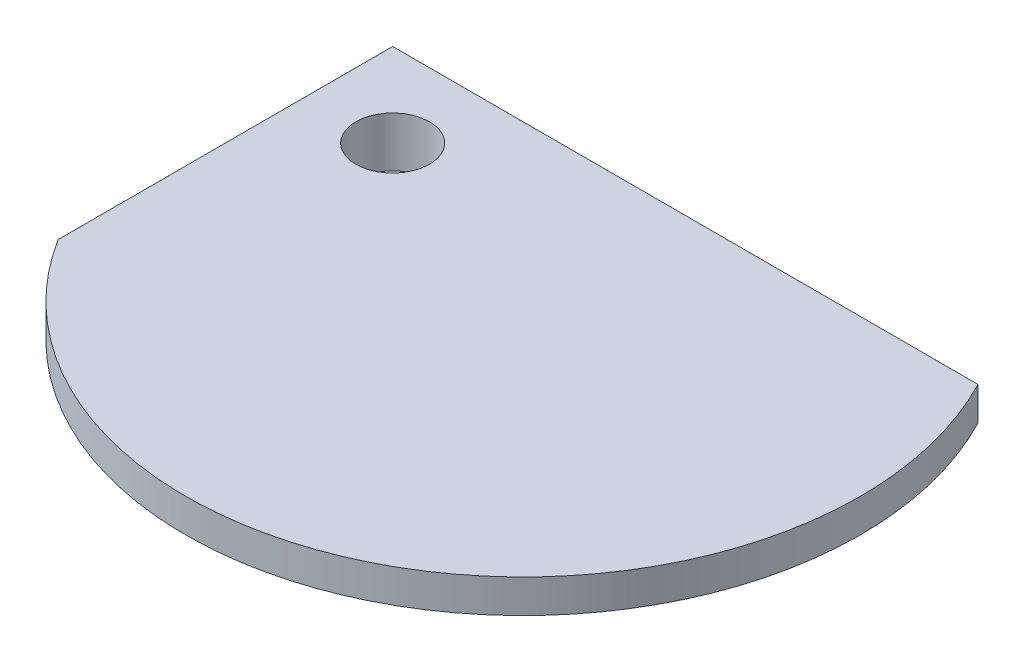
ISO-10303-21;
HEADER;
FILE_DESCRIPTION(('STEP AP214'),'2;1');
FILE_NAME('part.step','',(''),(''),'','','');
FILE_SCHEMA(('AUTOMOTIVE_DESIGN { 1 0 10303 214 1 1 1 1 }'));
ENDSEC;
DATA;
#1=APPLICATION_CONTEXT('core data for automotive mechanical design processes');
#2=APPLICATION_PROTOCOL_DEFINITION('international standard','automotive_design',2000,#1);
#3=PRODUCT_CONTEXT('',#1,'mechanical');
#4=PRODUCT('Part','Part','',(#3));
#5=PRODUCT_RELATED_PRODUCT_CATEGORY('part','',(#4));
#6=PRODUCT_DEFINITION_FORMATION('','',#4);
#7=PRODUCT_DEFINITION_CONTEXT('part definition',#1,'design');
#8=PRODUCT_DEFINITION('design','',#6,#7);
#9=PRODUCT_DEFINITION_SHAPE('','',#8);
#10=(LENGTH_UNIT() NAMED_UNIT(*) SI_UNIT(.MILLI.,.METRE.));
#11=(NAMED_UNIT(*) PLANE_ANGLE_UNIT() SI_UNIT($,.RADIAN.));
#12=(NAMED_UNIT(*) SI_UNIT($,.STERADIAN.) SOLID_ANGLE_UNIT());
#13=UNCERTAINTY_MEASURE_WITH_UNIT(LENGTH_MEASURE(1.E-05),#10,'distance_accuracy_value','');
#14=(GEOMETRIC_REPRESENTATION_CONTEXT(3) GLOBAL_UNCERTAINTY_ASSIGNED_CONTEXT((#13)) GLOBAL_UNIT_ASSIGNED_CONTEXT((#10,
#11,#12)) REPRESENTATION_CONTEXT('',''));
#15=CARTESIAN_POINT('',(0.,0.,0.));
#16=DIRECTION('',(0.,0.,1.));
#17=DIRECTION('',(1.,0.,0.));
#18=AXIS2_PLACEMENT_3D('',#15,#16,#17);
#19=CARTESIAN_POINT('',(0.,4.9784,0.));
#20=DIRECTION('',(0.,1.,0.));
#21=DIRECTION('',(0.,0.,1.));
#22=AXIS2_PLACEMENT_3D('',#19,#20,#21);
#23=PLANE('',#22);
#24=CARTESIAN_POINT('',(0.,4.9784,0.));
#25=DIRECTION('',(0.,1.,0.));
#26=DIRECTION('',(0.,0.,1.));
#27=AXIS2_PLACEMENT_3D('',#24,#25,#26);
#28=CIRCLE('',#27,6.35);
#29=CARTESIAN_POINT('',(0.,4.9784,6.35));
#30=VERTEX_POINT('',#29);
#31=EDGE_CURVE('E55',#30,#30,#28,.T.);
#32=ORIENTED_EDGE('',*,*,#31,.F.);
#33=EDGE_LOOP('',(#32));
#34=FACE_BOUND('',#33,.T.);
#35=CARTESIAN_POINT('',(0.,4.9784,0.));
#36=DIRECTION('',(0.,1.,0.));
#37=DIRECTION('',(0.,0.,1.));
#38=AXIS2_PLACEMENT_3D('',#35,#36,#37);
#39=CIRCLE('',#38,2.794);
#40=CARTESIAN_POINT('',(0.,4.9784,2.794));
#41=VERTEX_POINT('',#40);
#42=EDGE_CURVE('E116',#41,#41,#39,.T.);
#43=ORIENTED_EDGE('',*,*,#42,.T.);
#44=EDGE_LOOP('',(#43));
#45=FACE_BOUND('',#44,.T.);
#46=ADVANCED_FACE('F51',(#34,#45),#23,.F.);
#47=CARTESIAN_POINT('',(0.,6.2484,0.));
#48=DIRECTION('',(0.,-1.,0.));
#49=DIRECTION('',(0.,0.,-1.));
#50=AXIS2_PLACEMENT_3D('',#47,#48,#49);
#51=CYLINDRICAL_SURFACE('',#50,6.35);
#52=CARTESIAN_POINT('',(0.,6.2484,0.));
#53=DIRECTION('',(0.,1.,0.));
#54=DIRECTION('',(0.,0.,1.));
#55=AXIS2_PLACEMENT_3D('',#52,#53,#54);
#56=CIRCLE('',#55,6.35);
#57=CARTESIAN_POINT('',(0.,6.2484,-6.35));
#58=VERTEX_POINT('',#57);
#59=CARTESIAN_POINT('',(-6.35,6.2484,0.));
#60=VERTEX_POINT('',#59);
#61=EDGE_CURVE('E12',#58,#60,#56,.T.);
#62=ORIENTED_EDGE('',*,*,#61,.F.);
#63=EDGE_CURVE('E61',#60,#58,#56,.T.);
#64=ORIENTED_EDGE('',*,*,#63,.F.);
#65=EDGE_LOOP('',(#62,#64));
#66=FACE_BOUND('',#65,.T.);
#67=ORIENTED_EDGE('',*,*,#31,.T.);
#68=EDGE_LOOP('',(#67));
#69=FACE_BOUND('',#68,.T.);
#70=ADVANCED_FACE('F53',(#66,#69),#51,.T.);
#71=CARTESIAN_POINT('',(0.,6.2484,0.));
#72=DIRECTION('',(0.,-1.,0.));
#73=DIRECTION('',(0.,0.,-1.));
#74=AXIS2_PLACEMENT_3D('',#71,#72,#73);
#75=CYLINDRICAL_SURFACE('',#74,2.794);
#76=ORIENTED_EDGE('',*,*,#42,.F.);
#77=EDGE_LOOP('',(#76));
#78=FACE_BOUND('',#77,.T.);
#79=CARTESIAN_POINT('',(0.,8.7884,0.));
#80=DIRECTION('',(0.,1.,0.));
#81=DIRECTION('',(0.,0.,1.));
#82=AXIS2_PLACEMENT_3D('',#79,#80,#81);
#83=CIRCLE('',#82,2.794);
#84=CARTESIAN_POINT('',(0.,8.7884,2.794));
#85=VERTEX_POINT('',#84);
#86=EDGE_CURVE('E139',#85,#85,#83,.T.);
#87=ORIENTED_EDGE('',*,*,#86,.T.);
#88=EDGE_LOOP('',(#87));
#89=FACE_BOUND('',#88,.T.);
#90=ADVANCED_FACE('F165',(#78,#89),#75,.F.);
#91=CARTESIAN_POINT('',(15.3758511163717,6.2484,5.47648945365046));
#92=DIRECTION('',(0.,-1.,0.));
#93=DIRECTION('',(0.,0.,-1.));
#94=AXIS2_PLACEMENT_3D('',#91,#92,#93);
#95=PLANE('',#94);
#96=DIRECTION('',(-1.,0.,0.));
#97=VECTOR('',#96,1.);
#98=CARTESIAN_POINT('',(-6.35,6.2484,-6.35));
#99=LINE('',#98,#97);
#100=CARTESIAN_POINT('',(-6.35,6.2484,-6.35));
#101=VERTEX_POINT('',#100);
#102=EDGE_CURVE('E130',#58,#101,#99,.T.);
#103=ORIENTED_EDGE('',*,*,#102,.F.);
#104=ORIENTED_EDGE('',*,*,#61,.T.);
#105=DIRECTION('',(0.,0.,1.));
#106=VECTOR('',#105,1.);
#107=CARTESIAN_POINT('',(-6.35,6.2484,-6.35));
#108=LINE('',#107,#106);
#109=EDGE_CURVE('E134',#101,#60,#108,.T.);
#110=ORIENTED_EDGE('',*,*,#109,.F.);
#111=EDGE_LOOP('',(#103,#104,#110));
#112=FACE_BOUND('',#111,.T.);
#113=ADVANCED_FACE('F152',(#112),#95,.T.);
#114=CARTESIAN_POINT('',(15.3758511163717,8.7884,5.47648945365046));
#115=DIRECTION('',(0.,-1.,0.));
#116=DIRECTION('',(0.,0.,-1.));
#117=AXIS2_PLACEMENT_3D('',#114,#115,#116);
#118=PLANE('',#117);
#119=DIRECTION('',(0.,0.,1.));
#120=VECTOR('',#119,1.);
#121=CARTESIAN_POINT('',(-6.35,8.7884,-6.35));
#122=LINE('',#121,#120);
#123=CARTESIAN_POINT('',(-6.35,8.7884,-6.35));
#124=VERTEX_POINT('',#123);
#125=CARTESIAN_POINT('',(-6.35,8.7884,19.05));
#126=VERTEX_POINT('',#125);
#127=EDGE_CURVE('E99',#124,#126,#122,.T.);
#128=ORIENTED_EDGE('',*,*,#127,.T.);
#129=CARTESIAN_POINT('',(15.3758511163717,8.7884,5.47648945365046));
#130=DIRECTION('',(0.,1.,0.));
#131=DIRECTION('',(0.,0.,-1.));
#132=AXIS2_PLACEMENT_3D('',#129,#130,#131);
#133=CIRCLE('',#132,25.617431473171);
#134=CARTESIAN_POINT('',(38.1,8.7884,-6.35));
#135=VERTEX_POINT('',#134);
#136=EDGE_CURVE('E88',#126,#135,#133,.T.);
#137=ORIENTED_EDGE('',*,*,#136,.T.);
#138=DIRECTION('',(-1.,0.,0.));
#139=VECTOR('',#138,1.);
#140=CARTESIAN_POINT('',(-6.35,8.7884,-6.35));
#141=LINE('',#140,#139);
#142=EDGE_CURVE('E98',#135,#124,#141,.T.);
#143=ORIENTED_EDGE('',*,*,#142,.T.);
#144=EDGE_LOOP('',(#128,#137,#143));
#145=FACE_BOUND('',#144,.T.);
#146=ORIENTED_EDGE('',*,*,#86,.F.);
#147=EDGE_LOOP('',(#146));
#148=FACE_BOUND('',#147,.T.);
#149=ADVANCED_FACE('F102',(#145,#148),#118,.F.);
#150=CARTESIAN_POINT('',(-6.35,6.2484,19.05));
#151=VERTEX_POINT('',#150);
#152=EDGE_CURVE('E113',#60,#151,#108,.T.);
#153=ORIENTED_EDGE('',*,*,#152,.F.);
#154=ORIENTED_EDGE('',*,*,#63,.T.);
#155=CARTESIAN_POINT('',(38.1,6.2484,-6.35));
#156=VERTEX_POINT('',#155);
#157=EDGE_CURVE('E108',#156,#58,#99,.T.);
#158=ORIENTED_EDGE('',*,*,#157,.F.);
#159=CARTESIAN_POINT('',(15.3758511163717,6.2484,5.47648945365046));
#160=DIRECTION('',(0.,1.,0.));
#161=DIRECTION('',(0.,0.,-1.));
#162=AXIS2_PLACEMENT_3D('',#159,#160,#161);
#163=CIRCLE('',#162,25.617431473171);
#164=EDGE_CURVE('E131',#151,#156,#163,.T.);
#165=ORIENTED_EDGE('',*,*,#164,.F.);
#166=EDGE_LOOP('',(#153,#154,#158,#165));
#167=FACE_BOUND('',#166,.T.);
#168=ADVANCED_FACE('F154',(#167),#95,.T.);
#169=CARTESIAN_POINT('',(-6.35,8.7884,-6.35));
#170=DIRECTION('',(1.,0.,0.));
#171=DIRECTION('',(0.,0.,-1.));
#172=AXIS2_PLACEMENT_3D('',#169,#170,#171);
#173=PLANE('',#172);
#174=ORIENTED_EDGE('',*,*,#109,.T.);
#175=ORIENTED_EDGE('',*,*,#152,.T.);
#176=DIRECTION('',(0.,-1.,0.));
#177=VECTOR('',#176,1.);
#178=CARTESIAN_POINT('',(-6.35,8.7884,19.05));
#179=LINE('',#178,#177);
#180=EDGE_CURVE('E92',#126,#151,#179,.T.);
#181=ORIENTED_EDGE('',*,*,#180,.F.);
#182=ORIENTED_EDGE('',*,*,#127,.F.);
#183=DIRECTION('',(0.,-1.,0.));
#184=VECTOR('',#183,1.);
#185=CARTESIAN_POINT('',(-6.35,8.7884,-6.35));
#186=LINE('',#185,#184);
#187=EDGE_CURVE('E122',#124,#101,#186,.T.);
#188=ORIENTED_EDGE('',*,*,#187,.T.);
#189=EDGE_LOOP('',(#174,#175,#181,#182,#188));
#190=FACE_BOUND('',#189,.T.);
#191=ADVANCED_FACE('F111',(#190),#173,.F.);
#192=CARTESIAN_POINT('',(15.3758511163717,8.7884,5.47648945365046));
#193=DIRECTION('',(0.,-1.,0.));
#194=DIRECTION('',(0.,0.,-1.));
#195=AXIS2_PLACEMENT_3D('',#192,#193,#194);
#196=CYLINDRICAL_SURFACE('',#195,25.617431473171);
#197=ORIENTED_EDGE('',*,*,#164,.T.);
#198=DIRECTION('',(0.,-1.,0.));
#199=VECTOR('',#198,1.);
#200=CARTESIAN_POINT('',(38.1,8.7884,-6.35));
#201=LINE('',#200,#199);
#202=EDGE_CURVE('E94',#135,#156,#201,.T.);
#203=ORIENTED_EDGE('',*,*,#202,.F.);
#204=ORIENTED_EDGE('',*,*,#136,.F.);
#205=ORIENTED_EDGE('',*,*,#180,.T.);
#206=EDGE_LOOP('',(#197,#203,#204,#205));
#207=FACE_BOUND('',#206,.T.);
#208=ADVANCED_FACE('F90',(#207),#196,.T.);
#209=CARTESIAN_POINT('',(-6.35,8.7884,-6.35));
#210=DIRECTION('',(0.,0.,1.));
#211=DIRECTION('',(1.,0.,0.));
#212=AXIS2_PLACEMENT_3D('',#209,#210,#211);
#213=PLANE('',#212);
#214=ORIENTED_EDGE('',*,*,#157,.T.);
#215=ORIENTED_EDGE('',*,*,#102,.T.);
#216=ORIENTED_EDGE('',*,*,#187,.F.);
#217=ORIENTED_EDGE('',*,*,#142,.F.);
#218=ORIENTED_EDGE('',*,*,#202,.T.);
#219=EDGE_LOOP('',(#214,#215,#216,#217,#218));
#220=FACE_BOUND('',#219,.T.);
#221=ADVANCED_FACE('F148',(#220),#213,.F.);
#222=CLOSED_SHELL('',(#46,#70,#90,#113,#149,#168,#191,#208,#221));
#223=MANIFOLD_SOLID_BREP('B2',#222);
#224=CARTESIAN_POINT('',(0.,0.,0.));
#225=DIRECTION('',(0.,1.,0.));
#226=DIRECTION('',(0.,0.,1.));
#227=AXIS2_PLACEMENT_3D('',#224,#225,#226);
#228=PLANE('',#227);
#229=CARTESIAN_POINT('',(0.,0.,0.));
#230=DIRECTION('',(0.,1.,0.));
#231=DIRECTION('',(0.,0.,1.));
#232=AXIS2_PLACEMENT_3D('',#229,#230,#231);
#233=CIRCLE('',#232,4.572);
#234=CARTESIAN_POINT('',(0.,0.,4.572));
#235=VERTEX_POINT('',#234);
#236=EDGE_CURVE('E50',#235,#235,#233,.T.);
#237=ORIENTED_EDGE('',*,*,#236,.F.);
#238=EDGE_LOOP('',(#237));
#239=FACE_BOUND('',#238,.T.);
#240=CARTESIAN_POINT('',(0.,0.,0.));
#241=DIRECTION('',(0.,1.,0.));
#242=DIRECTION('',(0.,0.,1.));
#243=AXIS2_PLACEMENT_3D('',#240,#241,#242);
#244=CIRCLE('',#243,2.794);
#245=CARTESIAN_POINT('',(0.,0.,2.794));
#246=VERTEX_POINT('',#245);
#247=EDGE_CURVE('E265',#246,#246,#244,.T.);
#248=ORIENTED_EDGE('',*,*,#247,.T.);
#249=EDGE_LOOP('',(#248));
#250=FACE_BOUND('',#249,.T.);
#251=ADVANCED_FACE('F258',(#239,#250),#228,.F.);
#252=CARTESIAN_POINT('',(0.,3.2004,0.));
#253=DIRECTION('',(0.,-1.,0.));
#254=DIRECTION('',(0.,0.,-1.));
#255=AXIS2_PLACEMENT_3D('',#252,#253,#254);
#256=CYLINDRICAL_SURFACE('',#255,4.572);
#257=ORIENTED_EDGE('',*,*,#236,.T.);
#258=EDGE_LOOP('',(#257));
#259=FACE_BOUND('',#258,.T.);
#260=CARTESIAN_POINT('',(0.,4.9784,0.));
#261=DIRECTION('',(0.,1.,0.));
#262=DIRECTION('',(0.,0.,1.));
#263=AXIS2_PLACEMENT_3D('',#260,#261,#262);
#264=CIRCLE('',#263,4.572);
#265=CARTESIAN_POINT('',(0.,4.9784,4.572));
#266=VERTEX_POINT('',#265);
#267=EDGE_CURVE('E273',#266,#266,#264,.T.);
#268=ORIENTED_EDGE('',*,*,#267,.F.);
#269=EDGE_LOOP('',(#268));
#270=FACE_BOUND('',#269,.T.);
#271=ADVANCED_FACE('F260',(#259,#270),#256,.T.);
#272=CARTESIAN_POINT('',(0.,3.2004,0.));
#273=DIRECTION('',(0.,-1.,0.));
#274=DIRECTION('',(0.,0.,-1.));
#275=AXIS2_PLACEMENT_3D('',#272,#273,#274);
#276=CYLINDRICAL_SURFACE('',#275,2.794);
#277=CARTESIAN_POINT('',(0.,3.2004,0.));
#278=DIRECTION('',(0.,1.,0.));
#279=DIRECTION('',(0.,0.,1.));
#280=AXIS2_PLACEMENT_3D('',#277,#278,#279);
#281=CIRCLE('',#280,2.794);
#282=CARTESIAN_POINT('',(0.,3.2004,2.794));
#283=VERTEX_POINT('',#282);
#284=EDGE_CURVE('E269',#283,#283,#281,.T.);
#285=ORIENTED_EDGE('',*,*,#284,.T.);
#286=EDGE_LOOP('',(#285));
#287=FACE_BOUND('',#286,.T.);
#288=ORIENTED_EDGE('',*,*,#247,.F.);
#289=EDGE_LOOP('',(#288));
#290=FACE_BOUND('',#289,.T.);
#291=ADVANCED_FACE('F298',(#287,#290),#276,.F.);
#292=CARTESIAN_POINT('',(0.,3.2004,0.));
#293=DIRECTION('',(0.,1.,0.));
#294=DIRECTION('',(0.,0.,1.));
#295=AXIS2_PLACEMENT_3D('',#292,#293,#294);
#296=PLANE('',#295);
#297=CARTESIAN_POINT('',(0.,3.2004,0.));
#298=DIRECTION('',(0.,1.,0.));
#299=DIRECTION('',(0.,0.,1.));
#300=AXIS2_PLACEMENT_3D('',#297,#298,#299);
#301=CIRCLE('',#300,1.397);
#302=CARTESIAN_POINT('',(0.,3.2004,1.397));
#303=VERTEX_POINT('',#302);
#304=EDGE_CURVE('E279',#303,#303,#301,.T.);
#305=ORIENTED_EDGE('',*,*,#304,.T.);
#306=EDGE_LOOP('',(#305));
#307=FACE_BOUND('',#306,.T.);
#308=ORIENTED_EDGE('',*,*,#284,.F.);
#309=EDGE_LOOP('',(#308));
#310=FACE_BOUND('',#309,.T.);
#311=ADVANCED_FACE('F290',(#307,#310),#296,.F.);
#312=CARTESIAN_POINT('',(0.,4.9784,0.));
#313=DIRECTION('',(0.,1.,0.));
#314=DIRECTION('',(0.,0.,1.));
#315=AXIS2_PLACEMENT_3D('',#312,#313,#314);
#316=PLANE('',#315);
#317=ORIENTED_EDGE('',*,*,#267,.T.);
#318=EDGE_LOOP('',(#317));
#319=FACE_BOUND('',#318,.T.);
#320=CARTESIAN_POINT('',(0.,4.9784,0.));
#321=DIRECTION('',(0.,1.,0.));
#322=DIRECTION('',(0.,0.,1.));
#323=AXIS2_PLACEMENT_3D('',#320,#321,#322);
#324=CIRCLE('',#323,1.397);
#325=CARTESIAN_POINT('',(0.,4.9784,1.397));
#326=VERTEX_POINT('',#325);
#327=EDGE_CURVE('E278',#326,#326,#324,.T.);
#328=ORIENTED_EDGE('',*,*,#327,.F.);
#329=EDGE_LOOP('',(#328));
#330=FACE_BOUND('',#329,.T.);
#331=ADVANCED_FACE('F288',(#319,#330),#316,.T.);
#332=CARTESIAN_POINT('',(0.,4.9784,0.));
#333=DIRECTION('',(0.,-1.,0.));
#334=DIRECTION('',(0.,0.,-1.));
#335=AXIS2_PLACEMENT_3D('',#332,#333,#334);
#336=CYLINDRICAL_SURFACE('',#335,1.397);
#337=ORIENTED_EDGE('',*,*,#327,.T.);
#338=EDGE_LOOP('',(#337));
#339=FACE_BOUND('',#338,.T.);
#340=ORIENTED_EDGE('',*,*,#304,.F.);
#341=EDGE_LOOP('',(#340));
#342=FACE_BOUND('',#341,.T.);
#343=ADVANCED_FACE('F285',(#339,#342),#336,.F.);
#344=CLOSED_SHELL('',(#251,#271,#291,#311,#331,#343));
#345=MANIFOLD_SOLID_BREP('B6',#344);
#346=ADVANCED_BREP_SHAPE_REPRESENTATION('',(#18,#223,#345),#14);
#347=SHAPE_DEFINITION_REPRESENTATION(#9,#346);
ENDSEC;
END-ISO-10303-21;
